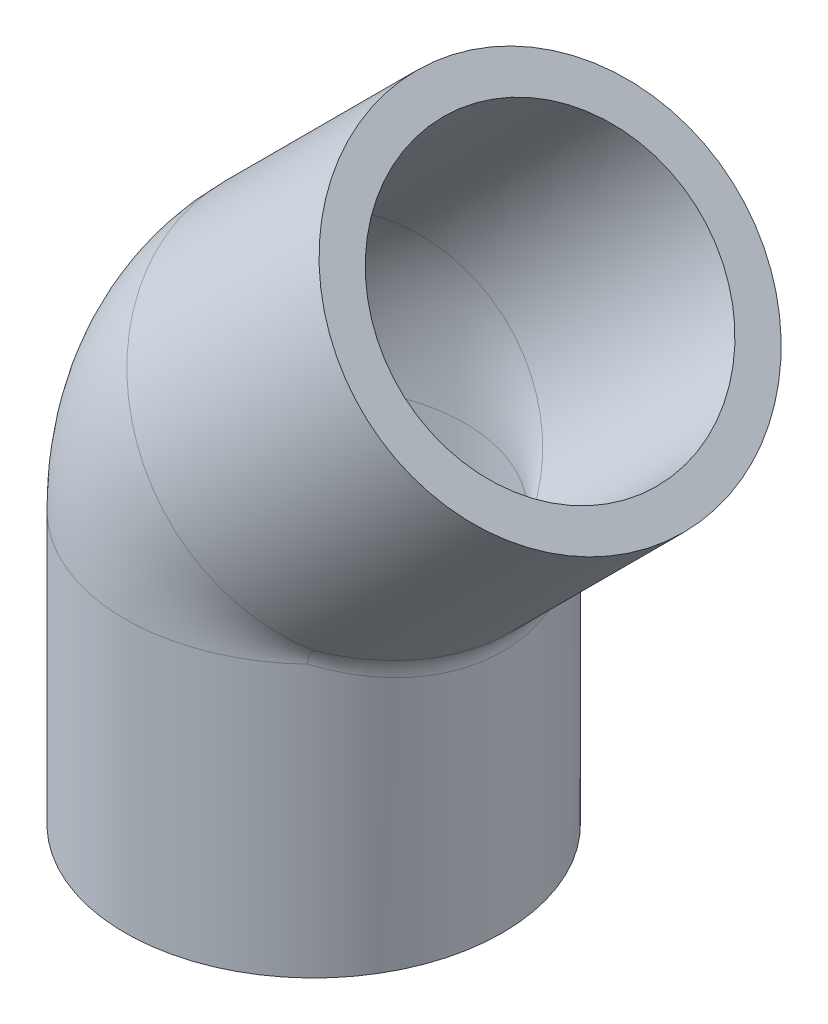
ISO-10303-21;
HEADER;
FILE_DESCRIPTION(('STEP AP214'),'2;1');
FILE_NAME('part.step','',(''),(''),'','','');
FILE_SCHEMA(('AUTOMOTIVE_DESIGN { 1 0 10303 214 1 1 1 1 }'));
ENDSEC;
DATA;
#1=APPLICATION_CONTEXT('core data for automotive mechanical design processes');
#2=APPLICATION_PROTOCOL_DEFINITION('international standard','automotive_design',2000,#1);
#3=PRODUCT_CONTEXT('',#1,'mechanical');
#4=PRODUCT('Part','Part','',(#3));
#5=PRODUCT_RELATED_PRODUCT_CATEGORY('part','',(#4));
#6=PRODUCT_DEFINITION_FORMATION('','',#4);
#7=PRODUCT_DEFINITION_CONTEXT('part definition',#1,'design');
#8=PRODUCT_DEFINITION('design','',#6,#7);
#9=PRODUCT_DEFINITION_SHAPE('','',#8);
#10=(LENGTH_UNIT() NAMED_UNIT(*) SI_UNIT(.MILLI.,.METRE.));
#11=(NAMED_UNIT(*) PLANE_ANGLE_UNIT() SI_UNIT($,.RADIAN.));
#12=(NAMED_UNIT(*) SI_UNIT($,.STERADIAN.) SOLID_ANGLE_UNIT());
#13=UNCERTAINTY_MEASURE_WITH_UNIT(LENGTH_MEASURE(1.E-05),#10,'distance_accuracy_value','');
#14=(GEOMETRIC_REPRESENTATION_CONTEXT(3) GLOBAL_UNCERTAINTY_ASSIGNED_CONTEXT((#13)) GLOBAL_UNIT_ASSIGNED_CONTEXT((#10,
#11,#12)) REPRESENTATION_CONTEXT('',''));
#15=CARTESIAN_POINT('',(0.,0.,0.));
#16=DIRECTION('',(0.,0.,1.));
#17=DIRECTION('',(1.,0.,0.));
#18=AXIS2_PLACEMENT_3D('',#15,#16,#17);
#19=CARTESIAN_POINT('',(28.1611652351682,37.8093975133089,0.));
#20=DIRECTION('',(-0.707106781186549,-0.707106781186546,0.));
#21=DIRECTION('',(0.707106781186546,-0.707106781186549,0.));
#22=AXIS2_PLACEMENT_3D('',#19,#20,#21);
#23=CYLINDRICAL_SURFACE('',#22,12.5);
#24=CARTESIAN_POINT('',(28.1611652351682,37.8093975133089,0.));
#25=DIRECTION('',(-0.707106781186548,-0.707106781186547,0.));
#26=DIRECTION('',(0.707106781186547,-0.707106781186548,0.));
#27=AXIS2_PLACEMENT_3D('',#24,#25,#26);
#28=CIRCLE('',#27,12.5);
#29=CARTESIAN_POINT('',(37.,28.9705627484771,0.));
#30=VERTEX_POINT('',#29);
#31=EDGE_CURVE('E94',#30,#30,#28,.T.);
#32=ORIENTED_EDGE('',*,*,#31,.T.);
#33=EDGE_LOOP('',(#32));
#34=FACE_BOUND('',#33,.T.);
#35=CARTESIAN_POINT('',(15.4289321881345,25.0771644662753,0.));
#36=DIRECTION('',(0.707106781186549,0.707106781186546,0.));
#37=DIRECTION('',(-0.707106781186546,0.707106781186549,0.));
#38=AXIS2_PLACEMENT_3D('',#35,#36,#37);
#39=CIRCLE('',#38,12.5);
#40=CARTESIAN_POINT('',(21.5246803018117,18.9814163525981,9.051724137931));
#41=VERTEX_POINT('',#40);
#42=CARTESIAN_POINT('',(21.5246803018117,18.9814163525981,-9.051724137931));
#43=VERTEX_POINT('',#42);
#44=EDGE_CURVE('E95',#41,#43,#39,.F.);
#45=ORIENTED_EDGE('',*,*,#44,.F.);
#46=CARTESIAN_POINT('',(12.5,22.1482322781408,0.));
#47=DIRECTION('',(0.331112051180259,0.943591442078192,0.));
#48=DIRECTION('',(-0.943591442078192,0.331112051180259,0.));
#49=AXIS2_PLACEMENT_3D('',#46,#47,#48);
#50=ELLIPSE('',#49,13.8680639247919,12.5);
#51=EDGE_CURVE('E104',#41,#43,#50,.T.);
#52=ORIENTED_EDGE('',*,*,#51,.T.);
#53=EDGE_LOOP('',(#45,#52));
#54=FACE_BOUND('',#53,.T.);
#55=ADVANCED_FACE('F46',(#34,#54),#23,.T.);
#56=CARTESIAN_POINT('',(12.5,18.0060966544098,0.));
#57=DIRECTION('',(0.,-1.,0.));
#58=DIRECTION('',(0.,0.,-1.));
#59=AXIS2_PLACEMENT_3D('',#56,#57,#58);
#60=CYLINDRICAL_SURFACE('',#59,12.5);
#61=CARTESIAN_POINT('',(12.5,0.,0.));
#62=DIRECTION('',(0.,-1.,0.));
#63=DIRECTION('',(1.,0.,0.));
#64=AXIS2_PLACEMENT_3D('',#61,#62,#63);
#65=CIRCLE('',#64,12.5);
#66=CARTESIAN_POINT('',(25.,0.,0.));
#67=VERTEX_POINT('',#66);
#68=EDGE_CURVE('E99',#67,#67,#65,.T.);
#69=ORIENTED_EDGE('',*,*,#68,.F.);
#70=EDGE_LOOP('',(#69));
#71=FACE_BOUND('',#70,.T.);
#72=CARTESIAN_POINT('',(12.5,18.0060966544098,0.));
#73=DIRECTION('',(0.,-1.,0.));
#74=DIRECTION('',(0.,0.,-1.));
#75=AXIS2_PLACEMENT_3D('',#72,#73,#74);
#76=CIRCLE('',#75,12.5);
#77=CARTESIAN_POINT('',(21.1206896551724,18.0060966544098,9.05172413793105));
#78=VERTEX_POINT('',#77);
#79=CARTESIAN_POINT('',(21.1206896551724,18.0060966544098,-9.05172413793106));
#80=VERTEX_POINT('',#79);
#81=EDGE_CURVE('E97',#78,#80,#76,.T.);
#82=ORIENTED_EDGE('',*,*,#81,.T.);
#83=CARTESIAN_POINT('',(12.5,22.1482322781408,0.));
#84=DIRECTION('',(0.433088330640935,0.901351484085231,0.));
#85=DIRECTION('',(-0.901351484085231,0.433088330640935,0.));
#86=AXIS2_PLACEMENT_3D('',#83,#84,#85);
#87=ELLIPSE('',#86,13.8680639247919,12.5);
#88=EDGE_CURVE('E12',#80,#78,#87,.F.);
#89=ORIENTED_EDGE('',*,*,#88,.T.);
#90=EDGE_LOOP('',(#82,#89));
#91=FACE_BOUND('',#90,.T.);
#92=ADVANCED_FACE('F122',(#71,#91),#60,.T.);
#93=CARTESIAN_POINT('',(22.5,18.0060966544098,0.));
#94=DIRECTION('',(0.,0.,1.));
#95=DIRECTION('',(1.,0.,0.));
#96=AXIS2_PLACEMENT_3D('',#93,#94,#95);
#97=DEGENERATE_TOROIDAL_SURFACE('',#96,9.99999999999999,12.5,.T.);
#98=ORIENTED_EDGE('',*,*,#44,.T.);
#99=CARTESIAN_POINT('',(12.5,22.1482322781408,-12.5));
#100=CARTESIAN_POINT('',(12.5,22.1482322781408,-12.5));
#101=CARTESIAN_POINT('',(12.5,22.1482322781408,-12.5));
#102=CARTESIAN_POINT('',(13.045166513195,21.886286456461,-12.5000969984712));
#103=CARTESIAN_POINT('',(13.058056504048,21.9170777055936,-12.5003596953597));
#104=CARTESIAN_POINT('',(13.0707146051692,21.947965006598,-12.5000969984712));
#105=CARTESIAN_POINT('',(13.5903704751114,21.62432264113,-12.464337516626));
#106=CARTESIAN_POINT('',(13.6164110717251,21.6857996710487,-12.4626553517548));
#107=CARTESIAN_POINT('',(13.6414684140161,21.7476839782431,-12.464337516626));
#108=CARTESIAN_POINT('',(14.6714430573218,21.104880527595,-12.3219606628794));
#109=CARTESIAN_POINT('',(14.7216364209456,21.228000341923,-12.3136078253336));
#110=CARTESIAN_POINT('',(14.7732032087665,21.3505512653218,-12.3219606628794));
#111=CARTESIAN_POINT('',(15.2073314647654,20.8473927219083,-12.2155191177127));
#112=CARTESIAN_POINT('',(15.2694124572759,21.0011040785321,-12.2022041865027));
#113=CARTESIAN_POINT('',(15.334204909103,21.1536923119331,-12.2155191177127));
#114=CARTESIAN_POINT('',(16.260601648369,20.3413093198338,-11.9333079099585));
#115=CARTESIAN_POINT('',(16.3430603555357,20.5563845578595,-11.907898886186));
#116=CARTESIAN_POINT('',(16.4368344038035,20.7667728281383,-11.9333079099585));
#117=CARTESIAN_POINT('',(16.7780601387241,20.0926768632163,-11.757874682501));
#118=CARTESIAN_POINT('',(16.8697780905737,20.3382109284643,-11.7248895549493));
#119=CARTESIAN_POINT('',(16.9785425074135,20.5766841167228,-11.757874682501));
#120=CARTESIAN_POINT('',(17.7855450405639,19.6085927273517,-11.3405553730193));
#121=CARTESIAN_POINT('',(17.8916712294402,19.9149289310498,-11.2916022284036));
#122=CARTESIAN_POINT('',(18.0332410885821,20.2065838858236,-11.3405553730193));
#123=CARTESIAN_POINT('',(18.2757358080157,19.3730620770785,-11.0991351869079));
#124=CARTESIAN_POINT('',(18.3875788779743,19.7095172573424,-11.0411983356989));
#125=CARTESIAN_POINT('',(18.5464036243078,20.0265119900689,-11.0991351869079));
#126=CARTESIAN_POINT('',(19.2202055240597,18.9192559649406,-10.5538431899703));
#127=CARTESIAN_POINT('',(19.3390823208137,19.3153916266736,-10.4785927559741));
#128=CARTESIAN_POINT('',(19.5351339443845,19.6795604284654,-10.5538431899703));
#129=CARTESIAN_POINT('',(19.6747558998034,18.7008500856594,-10.2505235096716));
#130=CARTESIAN_POINT('',(19.7952668266334,19.1264338174187,-10.1662865657356));
#131=CARTESIAN_POINT('',(20.0109858757545,19.5125810536769,-10.2505235096716));
#132=CARTESIAN_POINT('',(20.540055612785,18.2850841887633,-9.58655137103355));
#133=CARTESIAN_POINT('',(20.6596996791791,18.7683740061334,-9.48653751498423));
#134=CARTESIAN_POINT('',(20.9168360556439,19.1947126439501,-9.58655137103354));
#135=CARTESIAN_POINT('',(20.9511876163196,18.0875403046874,-9.22648460105323));
#136=CARTESIAN_POINT('',(21.0683715624169,18.5990965695357,-9.11906129202503));
#137=CARTESIAN_POINT('',(21.347234903318,19.0436830363001,-9.22648460105323));
#138=CARTESIAN_POINT('',(21.7225046316297,17.7169319410759,-8.45516223790088));
#139=CARTESIAN_POINT('',(21.8314635988518,18.2830134987055,-8.33647592617878));
#140=CARTESIAN_POINT('',(22.1546980823625,18.7603392314038,-8.45516223790088));
#141=CARTESIAN_POINT('',(22.0831690830708,17.5436370966627,-8.04446974873948));
#142=CARTESIAN_POINT('',(22.1861382375935,18.1361024531089,-7.92145765280556));
#143=CARTESIAN_POINT('',(22.5322643213386,18.6278489116862,-8.04446974873948));
#144=CARTESIAN_POINT('',(22.7472881461949,17.2245360340099,-7.17896606259242));
#145=CARTESIAN_POINT('',(22.8363136240752,17.866790990107,-7.05180345498785));
#146=CARTESIAN_POINT('',(23.2275059396746,18.3838843439214,-7.17896606259241));
#147=CARTESIAN_POINT('',(23.0512845975254,17.0784694684668,-6.72464321163755));
#148=CARTESIAN_POINT('',(23.1319153373735,17.7443487513981,-6.59743117451434));
#149=CARTESIAN_POINT('',(23.5457485508672,18.2722110507291,-6.72464321163754));
#150=CARTESIAN_POINT('',(23.5968150608253,16.8163487732265,-5.7797483318262));
#151=CARTESIAN_POINT('',(23.6603817745865,17.5254507858455,-5.65724126843346));
#152=CARTESIAN_POINT('',(24.1168441619041,18.0718100818797,-5.77974833182619));
#153=CARTESIAN_POINT('',(23.838900970638,16.700029463386,-5.28955058376657));
#154=CARTESIAN_POINT('',(23.8932291324149,17.4290022522702,-5.17189339616048));
#155=CARTESIAN_POINT('',(24.3702749231335,17.9828796661926,-5.28955058376657));
#156=CARTESIAN_POINT('',(24.256475529164,16.4993900106717,-4.28142652431907));
#157=CARTESIAN_POINT('',(24.2938261421032,17.2630695378112,-4.17778599637622));
#158=CARTESIAN_POINT('',(24.8074182427061,17.8294833817958,-4.28142652431907));
#159=CARTESIAN_POINT('',(24.4324620072123,16.4148306669095,-3.76374244092946));
#160=CARTESIAN_POINT('',(24.4614902195294,17.1936208030185,-3.66970998481319));
#161=CARTESIAN_POINT('',(24.9916519601182,17.7648346351576,-3.76374244092946));
#162=CARTESIAN_POINT('',(24.7149024706379,16.2791214891135,-2.70964911863048));
#163=CARTESIAN_POINT('',(24.7303112512381,17.0822714858337,-2.63786658503204));
#164=CARTESIAN_POINT('',(25.2873284069767,17.6610799480767,-2.70964911863048));
#165=CARTESIAN_POINT('',(24.8217346684502,16.2277899286443,-2.17335892820045));
#166=CARTESIAN_POINT('',(24.8313699064345,17.0404116202561,-2.1149712219634));
#167=CARTESIAN_POINT('',(25.3991670729954,17.6218350710511,-2.17335892820045));
#168=CARTESIAN_POINT('',(24.9641812006915,16.1593461173862,-1.09135807696834));
#169=CARTESIAN_POINT('',(24.9662458212481,16.9845441871028,-1.06089064818109));
#170=CARTESIAN_POINT('',(25.5482890649706,17.5695072452177,-1.09135807696834));
#171=CARTESIAN_POINT('',(25.,16.1421356237309,-0.545679038484171));
#172=CARTESIAN_POINT('',(25.,16.9705627484771,-0.530707427293305));
#173=CARTESIAN_POINT('',(25.5857864376269,17.556349186104,-0.545679038484171));
#174=CARTESIAN_POINT('',(25.,16.1421356237309,0.545679038484168));
#175=CARTESIAN_POINT('',(25.,16.9705627484771,0.530707427293301));
#176=CARTESIAN_POINT('',(25.5857864376269,17.556349186104,0.545679038484168));
#177=CARTESIAN_POINT('',(24.9641812006915,16.1593461173862,1.09135807696834));
#178=CARTESIAN_POINT('',(24.9662458212481,16.9845441871028,1.06089064818108));
#179=CARTESIAN_POINT('',(25.5482890649706,17.5695072452177,1.09135807696834));
#180=CARTESIAN_POINT('',(24.8217346684502,16.2277899286443,2.17335892820044));
#181=CARTESIAN_POINT('',(24.8313699064345,17.0404116202561,2.1149712219634));
#182=CARTESIAN_POINT('',(25.3991670729954,17.6218350710511,2.17335892820044));
#183=CARTESIAN_POINT('',(24.7149024706379,16.2791214891135,2.70964911863048));
#184=CARTESIAN_POINT('',(24.7303112512381,17.0822714858337,2.63786658503204));
#185=CARTESIAN_POINT('',(25.2873284069767,17.6610799480767,2.70964911863048));
#186=CARTESIAN_POINT('',(24.4324620072123,16.4148306669095,3.76374244092946));
#187=CARTESIAN_POINT('',(24.4614902195294,17.1936208030185,3.66970998481319));
#188=CARTESIAN_POINT('',(24.9916519601182,17.7648346351576,3.76374244092946));
#189=CARTESIAN_POINT('',(24.256475529164,16.4993900106717,4.28142652431906));
#190=CARTESIAN_POINT('',(24.2938261421032,17.2630695378112,4.17778599637622));
#191=CARTESIAN_POINT('',(24.8074182427061,17.8294833817958,4.28142652431906));
#192=CARTESIAN_POINT('',(23.838900970638,16.700029463386,5.28955058376657));
#193=CARTESIAN_POINT('',(23.8932291324149,17.4290022522702,5.17189339616048));
#194=CARTESIAN_POINT('',(24.3702749231335,17.9828796661926,5.28955058376657));
#195=CARTESIAN_POINT('',(23.5968150608253,16.8163487732265,5.77974833182619));
#196=CARTESIAN_POINT('',(23.6603817745865,17.5254507858455,5.65724126843346));
#197=CARTESIAN_POINT('',(24.1168441619041,18.0718100818797,5.77974833182619));
#198=CARTESIAN_POINT('',(23.0512845975254,17.0784694684668,6.72464321163754));
#199=CARTESIAN_POINT('',(23.1319153373735,17.7443487513981,6.59743117451433));
#200=CARTESIAN_POINT('',(23.5457485508672,18.2722110507291,6.72464321163754));
#201=CARTESIAN_POINT('',(22.7472881461949,17.2245360340099,7.17896606259241));
#202=CARTESIAN_POINT('',(22.8363136240752,17.866790990107,7.05180345498785));
#203=CARTESIAN_POINT('',(23.2275059396746,18.3838843439214,7.17896606259241));
#204=CARTESIAN_POINT('',(22.0831690830708,17.5436370966627,8.04446974873948));
#205=CARTESIAN_POINT('',(22.1861382375935,18.1361024531089,7.92145765280556));
#206=CARTESIAN_POINT('',(22.5322643213386,18.6278489116862,8.04446974873948));
#207=CARTESIAN_POINT('',(21.7225046316297,17.7169319410759,8.45516223790087));
#208=CARTESIAN_POINT('',(21.8314635988518,18.2830134987055,8.33647592617878));
#209=CARTESIAN_POINT('',(22.1546980823625,18.7603392314038,8.45516223790087));
#210=CARTESIAN_POINT('',(20.9511876163196,18.0875403046874,9.22648460105323));
#211=CARTESIAN_POINT('',(21.0683715624169,18.5990965695357,9.11906129202502));
#212=CARTESIAN_POINT('',(21.347234903318,19.0436830363001,9.22648460105323));
#213=CARTESIAN_POINT('',(20.540055612785,18.2850841887633,9.58655137103354));
#214=CARTESIAN_POINT('',(20.6596996791791,18.7683740061334,9.48653751498422));
#215=CARTESIAN_POINT('',(20.9168360556439,19.1947126439501,9.58655137103354));
#216=CARTESIAN_POINT('',(19.6747558998034,18.7008500856594,10.2505235096716));
#217=CARTESIAN_POINT('',(19.7952668266334,19.1264338174187,10.1662865657356));
#218=CARTESIAN_POINT('',(20.0109858757545,19.5125810536769,10.2505235096716));
#219=CARTESIAN_POINT('',(19.2202055240597,18.9192559649406,10.5538431899703));
#220=CARTESIAN_POINT('',(19.3390823208137,19.3153916266736,10.4785927559741));
#221=CARTESIAN_POINT('',(19.5351339443845,19.6795604284654,10.5538431899703));
#222=CARTESIAN_POINT('',(18.2757358080157,19.3730620770785,11.0991351869079));
#223=CARTESIAN_POINT('',(18.3875788779743,19.7095172573424,11.0411983356989));
#224=CARTESIAN_POINT('',(18.5464036243078,20.0265119900689,11.0991351869079));
#225=CARTESIAN_POINT('',(17.7855450405639,19.6085927273517,11.3405553730193));
#226=CARTESIAN_POINT('',(17.8916712294402,19.9149289310498,11.2916022284036));
#227=CARTESIAN_POINT('',(18.0332410885821,20.2065838858236,11.3405553730193));
#228=CARTESIAN_POINT('',(16.7780601387241,20.0926768632163,11.757874682501));
#229=CARTESIAN_POINT('',(16.8697780905737,20.3382109284643,11.7248895549493));
#230=CARTESIAN_POINT('',(16.9785425074135,20.5766841167228,11.757874682501));
#231=CARTESIAN_POINT('',(16.260601648369,20.3413093198338,11.9333079099585));
#232=CARTESIAN_POINT('',(16.3430603555357,20.5563845578595,11.907898886186));
#233=CARTESIAN_POINT('',(16.4368344038035,20.7667728281383,11.9333079099585));
#234=CARTESIAN_POINT('',(15.2073314647654,20.8473927219083,12.2155191177127));
#235=CARTESIAN_POINT('',(15.2694124572759,21.0011040785321,12.2022041865027));
#236=CARTESIAN_POINT('',(15.334204909103,21.1536923119331,12.2155191177127));
#237=CARTESIAN_POINT('',(14.6714430573218,21.104880527595,12.3219606628794));
#238=CARTESIAN_POINT('',(14.7216364209456,21.228000341923,12.3136078253336));
#239=CARTESIAN_POINT('',(14.7732032087665,21.3505512653218,12.3219606628794));
#240=CARTESIAN_POINT('',(13.5903704751114,21.62432264113,12.464337516626));
#241=CARTESIAN_POINT('',(13.6164110717251,21.6857996710487,12.4626553517548));
#242=CARTESIAN_POINT('',(13.6414684140161,21.7476839782431,12.464337516626));
#243=CARTESIAN_POINT('',(13.045166513195,21.886286456461,12.5000969984712));
#244=CARTESIAN_POINT('',(13.058056504048,21.9170777055936,12.5003596953597));
#245=CARTESIAN_POINT('',(13.0707146051693,21.947965006598,12.5000969984712));
#246=CARTESIAN_POINT('',(12.5,22.1482322781408,12.5));
#247=CARTESIAN_POINT('',(12.5,22.1482322781408,12.5));
#248=CARTESIAN_POINT('',(12.5,22.1482322781408,12.5));
#249=(BOUNDED_SURFACE() B_SPLINE_SURFACE(3,2,((#99,#100,#101),(#102,#103,#104),(#105,#106,#107),
(#108,#109,#110),(#111,#112,#113),(#114,#115,#116),(#117,#118,#119),(#120,#121,#122),(#123,#124,
#125),(#126,#127,#128),(#129,#130,#131),(#132,#133,#134),(#135,#136,#137),(#138,#139,#140),
(#141,#142,#143),(#144,#145,#146),(#147,#148,#149),(#150,#151,#152),(#153,#154,#155),(#156,#157,
#158),(#159,#160,#161),(#162,#163,#164),(#165,#166,#167),(#168,#169,#170),(#171,#172,#173),
(#174,#175,#176),(#177,#178,#179),(#180,#181,#182),(#183,#184,#185),(#186,#187,#188),(#189,#190,
#191),(#192,#193,#194),(#195,#196,#197),(#198,#199,#200),(#201,#202,#203),(#204,#205,#206),
(#207,#208,#209),(#210,#211,#212),(#213,#214,#215),(#216,#217,#218),(#219,#220,#221),(#222,#223,
#224),(#225,#226,#227),(#228,#229,#230),(#231,#232,#233),(#234,#235,#236),(#237,#238,#239),
(#240,#241,#242),(#243,#244,#245),(#246,#247,#248)),.UNSPECIFIED.,.F.,.F.,
.F.) B_SPLINE_SURFACE_WITH_KNOTS((4,2,2,2,2,2,2,2,2,2,2,2,2,2,2,2,2,2,2,2,2,2,2,2,4),(3,3),(0.,
2.05232014635456,4.09955402792064,6.13692604129012,8.16026921272345,10.1662969760592,
12.1528338718901,14.1189887865791,16.0652535680978,17.9935109154629,19.9069395831149,
21.809813047437,23.707199672224,25.6045862970111,27.5074597613332,29.4208884289852,
31.3491457763503,33.295410557869,35.261565472558,37.2481023683889,39.2541301317246,
41.277473303158,43.3148453165275,45.3620791980935,47.4143993444481),(0.,1.),
.UNSPECIFIED.) GEOMETRIC_REPRESENTATION_ITEM() RATIONAL_B_SPLINE_SURFACE(((1.,1.,1.),(1.,
1.00000770455809,1.),(1.,0.999582417768938,1.),(1.,0.997923059141941,1.),(1.,0.996690994328087,
1.),(1.,0.993482511475549,1.),(1.,0.991509707701099,1.),(1.,0.986943219953574,1.),(1.,
0.984353904746378,1.),(1.,0.978717283462866,1.),(1.,0.975674086422147,1.),(1.,0.969328133189486,
1.),(1.,0.966028186201993,1.),(1.,0.959390878711833,1.),(1.,0.956054249455289,1.),(1.,
0.949575820099404,1.),(1.,0.946432390524082,1.),(1.,0.940566037721066,1.),(1.,0.93783949293437,
1.),(1.,0.933007850306009,1.),(1.,0.930898134660145,1.),(1.,0.927458443663584,1.),(1.,
0.926124231167251,1.),(1.,0.924336039098184,1.),(1.,0.923879532511287,1.),(1.,0.923879532511287,
1.),(1.,0.924336039098184,1.),(1.,0.926124231167251,1.),(1.,0.927458443663584,1.),(1.,
0.930898134660144,1.),(1.,0.933007850306009,1.),(1.,0.93783949293437,1.),(1.,0.940566037721066,
1.),(1.,0.946432390524082,1.),(1.,0.949575820099404,1.),(1.,0.956054249455289,1.),(1.,
0.959390878711833,1.),(1.,0.966028186201993,1.),(1.,0.969328133189486,1.),(1.,0.975674086422147,
1.),(1.,0.978717283462866,1.),(1.,0.984353904746378,1.),(1.,0.986943219953574,1.),(1.,
0.991509707701099,1.),(1.,0.993482511475549,1.),(1.,0.996690994328087,1.),(1.,0.997923059141941,
1.),(1.,0.999582417768938,1.),(1.,1.00000770455809,1.),(1.,1.,1.))) REPRESENTATION_ITEM('') SURFACE());
#250=CARTESIAN_POINT('',(21.5246803018117,18.9814163525981,-9.05172413793101));
#251=CARTESIAN_POINT('',(21.5214017432943,18.9773616184371,-9.05120130472039));
#252=CARTESIAN_POINT('',(21.5181395497467,18.9732921476083,-9.050685423675));
#253=CARTESIAN_POINT('',(21.4612917023251,18.9017610798331,-9.04177266247253));
#254=CARTESIAN_POINT('',(21.4121904922111,18.8303459268159,-9.03528142964272));
#255=CARTESIAN_POINT('',(21.3241304698615,18.6811009816001,-9.02666018441748));
#256=CARTESIAN_POINT('',(21.2851949201418,18.6032570042397,-9.02454009962054));
#257=CARTESIAN_POINT('',(21.2187469573947,18.4428374313765,-9.02454009961797));
#258=CARTESIAN_POINT('',(21.1912345443672,18.3602618358738,-9.0266601844123));
#259=CARTESIAN_POINT('',(21.1479702705076,18.192461884098,-9.03528142963224));
#260=CARTESIAN_POINT('',(21.1321919301687,18.1072439464835,-9.0417726624594));
#261=CARTESIAN_POINT('',(21.1218093254748,18.0164663449887,-9.05068542367357));
#262=CARTESIAN_POINT('',(21.1212384942342,18.0112820753909,-9.05120130471968));
#263=CARTESIAN_POINT('',(21.1206896551724,18.0060966544098,-9.05172413793106));
#264=B_SPLINE_CURVE_WITH_KNOTS('',3,(#250,#251,#252,#253,#254,#255,#256,#257,#258,#259,#260,
#261,#262,#263),.UNSPECIFIED.,.F.,.F.,(4,2,2,2,2,2,4),(0.,0.015722920554357,0.275384876840721,
0.535635921543325,0.795886966244201,1.05554892253146,1.07127184308577),.UNSPECIFIED.);
#265=EDGE_CURVE('E59',#43,#80,#264,.T.);
#266=ORIENTED_EDGE('',*,*,#265,.T.);
#267=ORIENTED_EDGE('',*,*,#81,.F.);
#268=CARTESIAN_POINT('',(21.1206896551724,18.0060966544098,9.05172413793106));
#269=CARTESIAN_POINT('',(21.1212384942343,18.0112820753909,9.05120130471964));
#270=CARTESIAN_POINT('',(21.1218093254748,18.0164663449887,9.05068542367354));
#271=CARTESIAN_POINT('',(21.1321919301681,18.1072439464834,9.04177266246004));
#272=CARTESIAN_POINT('',(21.1479702704966,18.1924618841007,9.0352814296432));
#273=CARTESIAN_POINT('',(21.1912345443559,18.3602618358762,9.02666018442321));
#274=CARTESIAN_POINT('',(21.2187469573938,18.4428374313758,9.02454009961849));
#275=CARTESIAN_POINT('',(21.2851949201427,18.6032570042403,9.02454009962001));
#276=CARTESIAN_POINT('',(21.3241304698538,18.6811009816053,9.02666018442627));
#277=CARTESIAN_POINT('',(21.412190492202,18.8303459268216,9.03528142965312));
#278=CARTESIAN_POINT('',(21.4612917023229,18.9017610798348,9.04177266247522));
#279=CARTESIAN_POINT('',(21.5181395497465,18.9732921476084,9.05068542367521));
#280=CARTESIAN_POINT('',(21.5214017432943,18.9773616184371,9.05120130472049));
#281=CARTESIAN_POINT('',(21.5246803018117,18.9814163525981,9.051724137931));
#282=B_SPLINE_CURVE_WITH_KNOTS('',3,(#268,#269,#270,#271,#272,#273,#274,#275,#276,#277,#278,
#279,#280,#281),.UNSPECIFIED.,.F.,.F.,(4,2,2,2,2,2,4),(0.,0.0157229205543174,0.275384876840784,
0.535635921543505,0.795886966247819,1.05554892253339,1.07127184308777),.UNSPECIFIED.);
#283=EDGE_CURVE('E107',#78,#41,#282,.T.);
#284=ORIENTED_EDGE('',*,*,#283,.T.);
#285=EDGE_LOOP('',(#98,#266,#267,#284));
#286=FACE_BOUND('',#285,.T.);
#287=ADVANCED_FACE('F118',(#286),#97,.T.);
#288=CARTESIAN_POINT('',(28.1611652351682,37.8093975133089,0.));
#289=DIRECTION('',(-0.707106781186548,-0.707106781186547,0.));
#290=DIRECTION('',(0.707106781186547,-0.707106781186548,0.));
#291=AXIS2_PLACEMENT_3D('',#288,#289,#290);
#292=PLANE('',#291);
#293=CARTESIAN_POINT('',(28.1611652351682,37.8093975133089,0.));
#294=DIRECTION('',(-0.707106781186548,-0.707106781186547,0.));
#295=DIRECTION('',(0.707106781186547,-0.707106781186548,0.));
#296=AXIS2_PLACEMENT_3D('',#293,#294,#295);
#297=CIRCLE('',#296,10.);
#298=CARTESIAN_POINT('',(35.2322330470337,30.7383297014434,0.));
#299=VERTEX_POINT('',#298);
#300=EDGE_CURVE('E85',#299,#299,#297,.T.);
#301=ORIENTED_EDGE('',*,*,#300,.T.);
#302=EDGE_LOOP('',(#301));
#303=FACE_BOUND('',#302,.T.);
#304=ORIENTED_EDGE('',*,*,#31,.F.);
#305=EDGE_LOOP('',(#304));
#306=FACE_BOUND('',#305,.T.);
#307=ADVANCED_FACE('F121',(#303,#306),#292,.F.);
#308=CARTESIAN_POINT('',(12.5,0.,0.));
#309=DIRECTION('',(0.,-1.,0.));
#310=DIRECTION('',(1.,0.,0.));
#311=AXIS2_PLACEMENT_3D('',#308,#309,#310);
#312=PLANE('',#311);
#313=CARTESIAN_POINT('',(12.5,0.,0.));
#314=DIRECTION('',(0.,-1.,0.));
#315=DIRECTION('',(1.,0.,0.));
#316=AXIS2_PLACEMENT_3D('',#313,#314,#315);
#317=CIRCLE('',#316,10.);
#318=CARTESIAN_POINT('',(22.5,0.,0.));
#319=VERTEX_POINT('',#318);
#320=EDGE_CURVE('E87',#319,#319,#317,.T.);
#321=ORIENTED_EDGE('',*,*,#320,.F.);
#322=EDGE_LOOP('',(#321));
#323=FACE_BOUND('',#322,.T.);
#324=ORIENTED_EDGE('',*,*,#68,.T.);
#325=EDGE_LOOP('',(#324));
#326=FACE_BOUND('',#325,.T.);
#327=ADVANCED_FACE('F123',(#323,#326),#312,.T.);
#328=CARTESIAN_POINT('',(28.1611652351682,37.8093975133089,0.));
#329=DIRECTION('',(-0.707106781186549,-0.707106781186546,0.));
#330=DIRECTION('',(0.707106781186546,-0.707106781186549,0.));
#331=AXIS2_PLACEMENT_3D('',#328,#329,#330);
#332=CYLINDRICAL_SURFACE('',#331,10.);
#333=CARTESIAN_POINT('',(15.4289321881345,25.0771644662753,0.));
#334=DIRECTION('',(-0.707106781186548,-0.707106781186547,0.));
#335=DIRECTION('',(0.707106781186547,-0.707106781186548,0.));
#336=AXIS2_PLACEMENT_3D('',#333,#334,#335);
#337=CIRCLE('',#336,10.);
#338=CARTESIAN_POINT('',(22.5,18.0060966544098,0.));
#339=VERTEX_POINT('',#338);
#340=EDGE_CURVE('E80',#339,#339,#337,.T.);
#341=ORIENTED_EDGE('',*,*,#340,.T.);
#342=EDGE_LOOP('',(#341));
#343=FACE_BOUND('',#342,.T.);
#344=ORIENTED_EDGE('',*,*,#300,.F.);
#345=EDGE_LOOP('',(#344));
#346=FACE_BOUND('',#345,.T.);
#347=ADVANCED_FACE('F142',(#343,#346),#332,.F.);
#348=CARTESIAN_POINT('',(32.5,18.0060966544098,0.));
#349=DIRECTION('',(0.,-1.,0.));
#350=DIRECTION('',(1.,0.,0.));
#351=AXIS2_PLACEMENT_3D('',#348,#349,#350);
#352=CIRCLE('',#351,10.);
#353=TRIMMED_CURVE('',#352,(PARAMETER_VALUE(-3.14159260416823)),
(PARAMETER_VALUE(3.14159260416823)),.T.,.PARAMETER.);
#354=CARTESIAN_POINT('',(22.5,18.0060966544098,0.));
#355=DIRECTION('',(0.,0.,1.));
#356=AXIS1_PLACEMENT('',#354,#355);
#357=SURFACE_OF_REVOLUTION('',#353,#356);
#358=CARTESIAN_POINT('',(12.5,18.0060966544098,0.));
#359=DIRECTION('',(0.,-1.,0.));
#360=DIRECTION('',(1.,0.,0.));
#361=AXIS2_PLACEMENT_3D('',#358,#359,#360);
#362=CIRCLE('',#361,10.);
#363=EDGE_CURVE('E83',#339,#339,#362,.T.);
#364=ORIENTED_EDGE('',*,*,#363,.T.);
#365=ORIENTED_EDGE('',*,*,#340,.F.);
#366=EDGE_LOOP('',(#364,#365));
#367=FACE_BOUND('',#366,.T.);
#368=ADVANCED_FACE('F81',(#367),#357,.F.);
#369=CARTESIAN_POINT('',(12.5,18.0060966544098,0.));
#370=DIRECTION('',(0.,-1.,0.));
#371=DIRECTION('',(0.,0.,-1.));
#372=AXIS2_PLACEMENT_3D('',#369,#370,#371);
#373=CYLINDRICAL_SURFACE('',#372,10.);
#374=ORIENTED_EDGE('',*,*,#320,.T.);
#375=EDGE_LOOP('',(#374));
#376=FACE_BOUND('',#375,.T.);
#377=ORIENTED_EDGE('',*,*,#363,.F.);
#378=EDGE_LOOP('',(#377));
#379=FACE_BOUND('',#378,.T.);
#380=ADVANCED_FACE('F141',(#376,#379),#373,.F.);
#381=ORIENTED_EDGE('',*,*,#283,.F.);
#382=ORIENTED_EDGE('',*,*,#88,.F.);
#383=ORIENTED_EDGE('',*,*,#265,.F.);
#384=ORIENTED_EDGE('',*,*,#51,.F.);
#385=EDGE_LOOP('',(#381,#382,#383,#384));
#386=FACE_BOUND('',#385,.T.);
#387=ADVANCED_FACE('F48',(#386),#249,.F.);
#388=CLOSED_SHELL('',(#55,#92,#287,#307,#327,#347,#368,#380,#387));
#389=MANIFOLD_SOLID_BREP('B2',#388);
#390=ADVANCED_BREP_SHAPE_REPRESENTATION('',(#18,#389),#14);
#391=SHAPE_DEFINITION_REPRESENTATION(#9,#390);
ENDSEC;
END-ISO-10303-21;
